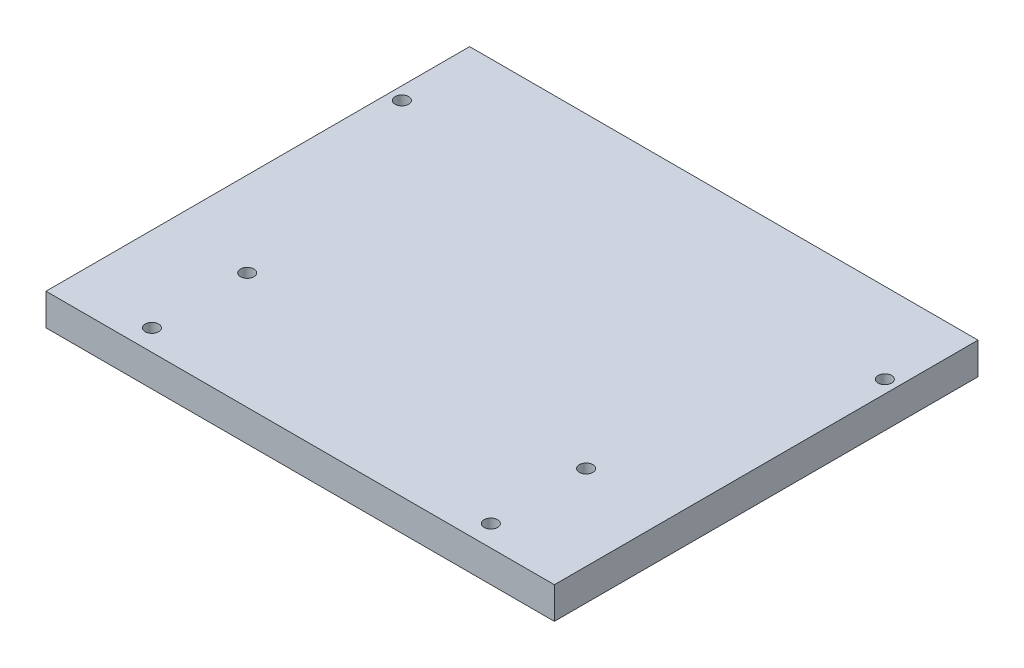
ISO-10303-21;
HEADER;
FILE_DESCRIPTION(('STEP AP214'),'2;1');
FILE_NAME('part.step','',(''),(''),'','','');
FILE_SCHEMA(('AUTOMOTIVE_DESIGN { 1 0 10303 214 1 1 1 1 }'));
ENDSEC;
DATA;
#1=APPLICATION_CONTEXT('core data for automotive mechanical design processes');
#2=APPLICATION_PROTOCOL_DEFINITION('international standard','automotive_design',2000,#1);
#3=PRODUCT_CONTEXT('',#1,'mechanical');
#4=PRODUCT('Part','Part','',(#3));
#5=PRODUCT_RELATED_PRODUCT_CATEGORY('part','',(#4));
#6=PRODUCT_DEFINITION_FORMATION('','',#4);
#7=PRODUCT_DEFINITION_CONTEXT('part definition',#1,'design');
#8=PRODUCT_DEFINITION('design','',#6,#7);
#9=PRODUCT_DEFINITION_SHAPE('','',#8);
#10=(LENGTH_UNIT() NAMED_UNIT(*) SI_UNIT(.MILLI.,.METRE.));
#11=(NAMED_UNIT(*) PLANE_ANGLE_UNIT() SI_UNIT($,.RADIAN.));
#12=(NAMED_UNIT(*) SI_UNIT($,.STERADIAN.) SOLID_ANGLE_UNIT());
#13=UNCERTAINTY_MEASURE_WITH_UNIT(LENGTH_MEASURE(1.E-05),#10,'distance_accuracy_value','');
#14=(GEOMETRIC_REPRESENTATION_CONTEXT(3) GLOBAL_UNCERTAINTY_ASSIGNED_CONTEXT((#13)) GLOBAL_UNIT_ASSIGNED_CONTEXT((#10,
#11,#12)) REPRESENTATION_CONTEXT('',''));
#15=CARTESIAN_POINT('',(0.,0.,0.));
#16=DIRECTION('',(0.,0.,1.));
#17=DIRECTION('',(1.,0.,0.));
#18=AXIS2_PLACEMENT_3D('',#15,#16,#17);
#19=CARTESIAN_POINT('',(0.,9.525,0.));
#20=DIRECTION('',(0.,-1.,0.));
#21=DIRECTION('',(0.,0.,-1.));
#22=AXIS2_PLACEMENT_3D('',#19,#20,#21);
#23=PLANE('',#22);
#24=CARTESIAN_POINT('',(3.81,9.525,-102.87));
#25=DIRECTION('',(0.,1.,0.));
#26=DIRECTION('',(0.,0.,1.));
#27=AXIS2_PLACEMENT_3D('',#24,#25,#26);
#28=CIRCLE('',#27,2.01929999999999);
#29=CARTESIAN_POINT('',(3.81,9.525,-100.8507));
#30=VERTEX_POINT('',#29);
#31=EDGE_CURVE('E149',#30,#30,#28,.T.);
#32=ORIENTED_EDGE('',*,*,#31,.F.);
#33=EDGE_LOOP('',(#32));
#34=FACE_BOUND('',#33,.T.);
#35=CARTESIAN_POINT('',(148.59,9.525,-102.87));
#36=DIRECTION('',(0.,1.,0.));
#37=DIRECTION('',(0.,0.,1.));
#38=AXIS2_PLACEMENT_3D('',#35,#36,#37);
#39=CIRCLE('',#38,2.0193);
#40=CARTESIAN_POINT('',(148.59,9.525,-100.8507));
#41=VERTEX_POINT('',#40);
#42=EDGE_CURVE('E143',#41,#41,#39,.T.);
#43=ORIENTED_EDGE('',*,*,#42,.F.);
#44=EDGE_LOOP('',(#43));
#45=FACE_BOUND('',#44,.T.);
#46=CARTESIAN_POINT('',(25.4,9.525,-34.925));
#47=DIRECTION('',(0.,1.,0.));
#48=DIRECTION('',(0.,0.,1.));
#49=AXIS2_PLACEMENT_3D('',#46,#47,#48);
#50=CIRCLE('',#49,2.0193);
#51=CARTESIAN_POINT('',(25.4,9.525,-32.9057));
#52=VERTEX_POINT('',#51);
#53=EDGE_CURVE('E131',#52,#52,#50,.T.);
#54=ORIENTED_EDGE('',*,*,#53,.F.);
#55=EDGE_LOOP('',(#54));
#56=FACE_BOUND('',#55,.T.);
#57=CARTESIAN_POINT('',(127.,9.525,-34.925));
#58=DIRECTION('',(0.,1.,0.));
#59=DIRECTION('',(0.,0.,1.));
#60=AXIS2_PLACEMENT_3D('',#57,#58,#59);
#61=CIRCLE('',#60,2.0193);
#62=CARTESIAN_POINT('',(127.,9.525,-32.9057));
#63=VERTEX_POINT('',#62);
#64=EDGE_CURVE('E125',#63,#63,#61,.T.);
#65=ORIENTED_EDGE('',*,*,#64,.F.);
#66=EDGE_LOOP('',(#65));
#67=FACE_BOUND('',#66,.T.);
#68=CARTESIAN_POINT('',(127.,9.525,-6.35));
#69=DIRECTION('',(0.,1.,0.));
#70=DIRECTION('',(0.,0.,1.));
#71=AXIS2_PLACEMENT_3D('',#68,#69,#70);
#72=CIRCLE('',#71,2.0193);
#73=CARTESIAN_POINT('',(127.,9.525,-4.3307));
#74=VERTEX_POINT('',#73);
#75=EDGE_CURVE('E119',#74,#74,#72,.T.);
#76=ORIENTED_EDGE('',*,*,#75,.F.);
#77=EDGE_LOOP('',(#76));
#78=FACE_BOUND('',#77,.T.);
#79=DIRECTION('',(0.,0.,1.));
#80=VECTOR('',#79,1.);
#81=CARTESIAN_POINT('',(0.,9.525,0.));
#82=LINE('',#81,#80);
#83=CARTESIAN_POINT('',(0.,9.525,-127.));
#84=VERTEX_POINT('',#83);
#85=CARTESIAN_POINT('',(0.,9.525,0.));
#86=VERTEX_POINT('',#85);
#87=EDGE_CURVE('E91',#84,#86,#82,.T.);
#88=ORIENTED_EDGE('',*,*,#87,.T.);
#89=DIRECTION('',(1.,0.,0.));
#90=VECTOR('',#89,1.);
#91=CARTESIAN_POINT('',(0.,9.525,0.));
#92=LINE('',#91,#90);
#93=CARTESIAN_POINT('',(152.4,9.525,0.));
#94=VERTEX_POINT('',#93);
#95=EDGE_CURVE('E86',#86,#94,#92,.T.);
#96=ORIENTED_EDGE('',*,*,#95,.T.);
#97=DIRECTION('',(0.,0.,-1.));
#98=VECTOR('',#97,1.);
#99=CARTESIAN_POINT('',(152.4,9.525,0.));
#100=LINE('',#99,#98);
#101=CARTESIAN_POINT('',(152.4,9.525,-127.));
#102=VERTEX_POINT('',#101);
#103=EDGE_CURVE('E89',#94,#102,#100,.T.);
#104=ORIENTED_EDGE('',*,*,#103,.T.);
#105=DIRECTION('',(-1.,0.,0.));
#106=VECTOR('',#105,1.);
#107=CARTESIAN_POINT('',(0.,9.525,-127.));
#108=LINE('',#107,#106);
#109=EDGE_CURVE('E56',#102,#84,#108,.T.);
#110=ORIENTED_EDGE('',*,*,#109,.T.);
#111=EDGE_LOOP('',(#88,#96,#104,#110));
#112=FACE_BOUND('',#111,.T.);
#113=CARTESIAN_POINT('',(25.4,9.525,-6.35));
#114=DIRECTION('',(0.,1.,0.));
#115=DIRECTION('',(0.,0.,1.));
#116=AXIS2_PLACEMENT_3D('',#113,#114,#115);
#117=CIRCLE('',#116,2.0193);
#118=CARTESIAN_POINT('',(25.4,9.525,-4.3307));
#119=VERTEX_POINT('',#118);
#120=EDGE_CURVE('E137',#119,#119,#117,.T.);
#121=ORIENTED_EDGE('',*,*,#120,.F.);
#122=EDGE_LOOP('',(#121));
#123=FACE_BOUND('',#122,.T.);
#124=ADVANCED_FACE('F39',(#34,#45,#56,#67,#78,#112,#123),#23,.F.);
#125=CARTESIAN_POINT('',(0.,9.525,0.));
#126=DIRECTION('',(1.,0.,0.));
#127=DIRECTION('',(0.,0.,-1.));
#128=AXIS2_PLACEMENT_3D('',#125,#126,#127);
#129=PLANE('',#128);
#130=DIRECTION('',(0.,0.,1.));
#131=VECTOR('',#130,1.);
#132=CARTESIAN_POINT('',(0.,0.,0.));
#133=LINE('',#132,#131);
#134=CARTESIAN_POINT('',(0.,0.,-127.));
#135=VERTEX_POINT('',#134);
#136=CARTESIAN_POINT('',(0.,0.,0.));
#137=VERTEX_POINT('',#136);
#138=EDGE_CURVE('E103',#135,#137,#133,.T.);
#139=ORIENTED_EDGE('',*,*,#138,.T.);
#140=DIRECTION('',(0.,-1.,0.));
#141=VECTOR('',#140,1.);
#142=CARTESIAN_POINT('',(0.,9.525,0.));
#143=LINE('',#142,#141);
#144=EDGE_CURVE('E11',#86,#137,#143,.T.);
#145=ORIENTED_EDGE('',*,*,#144,.F.);
#146=ORIENTED_EDGE('',*,*,#87,.F.);
#147=DIRECTION('',(0.,-1.,0.));
#148=VECTOR('',#147,1.);
#149=CARTESIAN_POINT('',(0.,9.525,-127.));
#150=LINE('',#149,#148);
#151=EDGE_CURVE('E99',#84,#135,#150,.T.);
#152=ORIENTED_EDGE('',*,*,#151,.T.);
#153=EDGE_LOOP('',(#139,#145,#146,#152));
#154=FACE_BOUND('',#153,.T.);
#155=ADVANCED_FACE('F41',(#154),#129,.F.);
#156=CARTESIAN_POINT('',(0.,9.525,0.));
#157=DIRECTION('',(0.,0.,-1.));
#158=DIRECTION('',(-1.,0.,0.));
#159=AXIS2_PLACEMENT_3D('',#156,#157,#158);
#160=PLANE('',#159);
#161=DIRECTION('',(1.,0.,0.));
#162=VECTOR('',#161,1.);
#163=CARTESIAN_POINT('',(0.,0.,0.));
#164=LINE('',#163,#162);
#165=CARTESIAN_POINT('',(152.4,0.,0.));
#166=VERTEX_POINT('',#165);
#167=EDGE_CURVE('E95',#137,#166,#164,.T.);
#168=ORIENTED_EDGE('',*,*,#167,.T.);
#169=DIRECTION('',(0.,-1.,0.));
#170=VECTOR('',#169,1.);
#171=CARTESIAN_POINT('',(152.4,9.525,0.));
#172=LINE('',#171,#170);
#173=EDGE_CURVE('E48',#94,#166,#172,.T.);
#174=ORIENTED_EDGE('',*,*,#173,.F.);
#175=ORIENTED_EDGE('',*,*,#95,.F.);
#176=ORIENTED_EDGE('',*,*,#144,.T.);
#177=EDGE_LOOP('',(#168,#174,#175,#176));
#178=FACE_BOUND('',#177,.T.);
#179=ADVANCED_FACE('F94',(#178),#160,.F.);
#180=CARTESIAN_POINT('',(152.4,9.525,0.));
#181=DIRECTION('',(-1.,0.,0.));
#182=DIRECTION('',(0.,0.,1.));
#183=AXIS2_PLACEMENT_3D('',#180,#181,#182);
#184=PLANE('',#183);
#185=DIRECTION('',(0.,0.,-1.));
#186=VECTOR('',#185,1.);
#187=CARTESIAN_POINT('',(152.4,0.,0.));
#188=LINE('',#187,#186);
#189=CARTESIAN_POINT('',(152.4,0.,-127.));
#190=VERTEX_POINT('',#189);
#191=EDGE_CURVE('E73',#166,#190,#188,.T.);
#192=ORIENTED_EDGE('',*,*,#191,.T.);
#193=DIRECTION('',(0.,-1.,0.));
#194=VECTOR('',#193,1.);
#195=CARTESIAN_POINT('',(152.4,9.525,-127.));
#196=LINE('',#195,#194);
#197=EDGE_CURVE('E96',#102,#190,#196,.T.);
#198=ORIENTED_EDGE('',*,*,#197,.F.);
#199=ORIENTED_EDGE('',*,*,#103,.F.);
#200=ORIENTED_EDGE('',*,*,#173,.T.);
#201=EDGE_LOOP('',(#192,#198,#199,#200));
#202=FACE_BOUND('',#201,.T.);
#203=ADVANCED_FACE('F97',(#202),#184,.F.);
#204=CARTESIAN_POINT('',(0.,9.525,-127.));
#205=DIRECTION('',(0.,0.,1.));
#206=DIRECTION('',(1.,0.,0.));
#207=AXIS2_PLACEMENT_3D('',#204,#205,#206);
#208=PLANE('',#207);
#209=DIRECTION('',(-1.,0.,0.));
#210=VECTOR('',#209,1.);
#211=CARTESIAN_POINT('',(0.,0.,-127.));
#212=LINE('',#211,#210);
#213=EDGE_CURVE('E79',#190,#135,#212,.T.);
#214=ORIENTED_EDGE('',*,*,#213,.T.);
#215=ORIENTED_EDGE('',*,*,#151,.F.);
#216=ORIENTED_EDGE('',*,*,#109,.F.);
#217=ORIENTED_EDGE('',*,*,#197,.T.);
#218=EDGE_LOOP('',(#214,#215,#216,#217));
#219=FACE_BOUND('',#218,.T.);
#220=ADVANCED_FACE('F111',(#219),#208,.F.);
#221=CARTESIAN_POINT('',(0.,0.,0.));
#222=DIRECTION('',(0.,-1.,0.));
#223=DIRECTION('',(0.,0.,-1.));
#224=AXIS2_PLACEMENT_3D('',#221,#222,#223);
#225=PLANE('',#224);
#226=CARTESIAN_POINT('',(3.81,0.,-102.87));
#227=DIRECTION('',(0.,1.,0.));
#228=DIRECTION('',(0.,0.,1.));
#229=AXIS2_PLACEMENT_3D('',#226,#227,#228);
#230=CIRCLE('',#229,2.0193);
#231=CARTESIAN_POINT('',(3.81,0.,-100.8507));
#232=VERTEX_POINT('',#231);
#233=EDGE_CURVE('E146',#232,#232,#230,.T.);
#234=ORIENTED_EDGE('',*,*,#233,.T.);
#235=EDGE_LOOP('',(#234));
#236=FACE_BOUND('',#235,.T.);
#237=CARTESIAN_POINT('',(148.59,0.,-102.87));
#238=DIRECTION('',(0.,1.,0.));
#239=DIRECTION('',(0.,0.,1.));
#240=AXIS2_PLACEMENT_3D('',#237,#238,#239);
#241=CIRCLE('',#240,2.0193);
#242=CARTESIAN_POINT('',(148.59,0.,-100.8507));
#243=VERTEX_POINT('',#242);
#244=EDGE_CURVE('E140',#243,#243,#241,.T.);
#245=ORIENTED_EDGE('',*,*,#244,.T.);
#246=EDGE_LOOP('',(#245));
#247=FACE_BOUND('',#246,.T.);
#248=CARTESIAN_POINT('',(25.4,0.,-6.35));
#249=DIRECTION('',(0.,-1.,0.));
#250=DIRECTION('',(0.,0.,-1.));
#251=AXIS2_PLACEMENT_3D('',#248,#249,#250);
#252=CIRCLE('',#251,2.0193);
#253=CARTESIAN_POINT('',(25.4,0.,-8.3693));
#254=VERTEX_POINT('',#253);
#255=EDGE_CURVE('E134',#254,#254,#252,.T.);
#256=ORIENTED_EDGE('',*,*,#255,.F.);
#257=EDGE_LOOP('',(#256));
#258=FACE_BOUND('',#257,.T.);
#259=CARTESIAN_POINT('',(25.4,0.,-34.925));
#260=DIRECTION('',(0.,-1.,0.));
#261=DIRECTION('',(0.,0.,-1.));
#262=AXIS2_PLACEMENT_3D('',#259,#260,#261);
#263=CIRCLE('',#262,2.0193);
#264=CARTESIAN_POINT('',(25.4,0.,-36.9443));
#265=VERTEX_POINT('',#264);
#266=EDGE_CURVE('E128',#265,#265,#263,.T.);
#267=ORIENTED_EDGE('',*,*,#266,.F.);
#268=EDGE_LOOP('',(#267));
#269=FACE_BOUND('',#268,.T.);
#270=CARTESIAN_POINT('',(127.,0.,-34.925));
#271=DIRECTION('',(0.,-1.,0.));
#272=DIRECTION('',(0.,0.,-1.));
#273=AXIS2_PLACEMENT_3D('',#270,#271,#272);
#274=CIRCLE('',#273,2.0193);
#275=CARTESIAN_POINT('',(127.,0.,-36.9443));
#276=VERTEX_POINT('',#275);
#277=EDGE_CURVE('E122',#276,#276,#274,.T.);
#278=ORIENTED_EDGE('',*,*,#277,.F.);
#279=EDGE_LOOP('',(#278));
#280=FACE_BOUND('',#279,.T.);
#281=CARTESIAN_POINT('',(127.,0.,-6.35));
#282=DIRECTION('',(0.,-1.,0.));
#283=DIRECTION('',(0.,0.,-1.));
#284=AXIS2_PLACEMENT_3D('',#281,#282,#283);
#285=CIRCLE('',#284,2.0193);
#286=CARTESIAN_POINT('',(127.,0.,-8.3693));
#287=VERTEX_POINT('',#286);
#288=EDGE_CURVE('E106',#287,#287,#285,.T.);
#289=ORIENTED_EDGE('',*,*,#288,.F.);
#290=EDGE_LOOP('',(#289));
#291=FACE_BOUND('',#290,.T.);
#292=ORIENTED_EDGE('',*,*,#138,.F.);
#293=ORIENTED_EDGE('',*,*,#213,.F.);
#294=ORIENTED_EDGE('',*,*,#191,.F.);
#295=ORIENTED_EDGE('',*,*,#167,.F.);
#296=EDGE_LOOP('',(#292,#293,#294,#295));
#297=FACE_BOUND('',#296,.T.);
#298=ADVANCED_FACE('F114',(#236,#247,#258,#269,#280,#291,#297),#225,.T.);
#299=CARTESIAN_POINT('',(127.,9.525,-6.35));
#300=DIRECTION('',(0.,1.,0.));
#301=DIRECTION('',(0.,0.,1.));
#302=AXIS2_PLACEMENT_3D('',#299,#300,#301);
#303=CYLINDRICAL_SURFACE('',#302,2.0193);
#304=ORIENTED_EDGE('',*,*,#75,.T.);
#305=EDGE_LOOP('',(#304));
#306=FACE_BOUND('',#305,.T.);
#307=ORIENTED_EDGE('',*,*,#288,.T.);
#308=EDGE_LOOP('',(#307));
#309=FACE_BOUND('',#308,.T.);
#310=ADVANCED_FACE('F166',(#306,#309),#303,.F.);
#311=CARTESIAN_POINT('',(127.,9.525,-34.925));
#312=DIRECTION('',(0.,1.,0.));
#313=DIRECTION('',(0.,0.,1.));
#314=AXIS2_PLACEMENT_3D('',#311,#312,#313);
#315=CYLINDRICAL_SURFACE('',#314,2.0193);
#316=ORIENTED_EDGE('',*,*,#64,.T.);
#317=EDGE_LOOP('',(#316));
#318=FACE_BOUND('',#317,.T.);
#319=ORIENTED_EDGE('',*,*,#277,.T.);
#320=EDGE_LOOP('',(#319));
#321=FACE_BOUND('',#320,.T.);
#322=ADVANCED_FACE('F169',(#318,#321),#315,.F.);
#323=CARTESIAN_POINT('',(25.4,9.525,-34.925));
#324=DIRECTION('',(0.,1.,0.));
#325=DIRECTION('',(0.,0.,1.));
#326=AXIS2_PLACEMENT_3D('',#323,#324,#325);
#327=CYLINDRICAL_SURFACE('',#326,2.0193);
#328=ORIENTED_EDGE('',*,*,#53,.T.);
#329=EDGE_LOOP('',(#328));
#330=FACE_BOUND('',#329,.T.);
#331=ORIENTED_EDGE('',*,*,#266,.T.);
#332=EDGE_LOOP('',(#331));
#333=FACE_BOUND('',#332,.T.);
#334=ADVANCED_FACE('F242',(#330,#333),#327,.F.);
#335=CARTESIAN_POINT('',(25.4,9.525,-6.35));
#336=DIRECTION('',(0.,1.,0.));
#337=DIRECTION('',(0.,0.,1.));
#338=AXIS2_PLACEMENT_3D('',#335,#336,#337);
#339=CYLINDRICAL_SURFACE('',#338,2.0193);
#340=ORIENTED_EDGE('',*,*,#120,.T.);
#341=EDGE_LOOP('',(#340));
#342=FACE_BOUND('',#341,.T.);
#343=ORIENTED_EDGE('',*,*,#255,.T.);
#344=EDGE_LOOP('',(#343));
#345=FACE_BOUND('',#344,.T.);
#346=ADVANCED_FACE('F200',(#342,#345),#339,.F.);
#347=CARTESIAN_POINT('',(148.59,9.525,-102.87));
#348=DIRECTION('',(0.,1.,0.));
#349=DIRECTION('',(0.,0.,1.));
#350=AXIS2_PLACEMENT_3D('',#347,#348,#349);
#351=CYLINDRICAL_SURFACE('',#350,2.0193);
#352=ORIENTED_EDGE('',*,*,#244,.F.);
#353=EDGE_LOOP('',(#352));
#354=FACE_BOUND('',#353,.T.);
#355=ORIENTED_EDGE('',*,*,#42,.T.);
#356=EDGE_LOOP('',(#355));
#357=FACE_BOUND('',#356,.T.);
#358=ADVANCED_FACE('F210',(#354,#357),#351,.F.);
#359=CARTESIAN_POINT('',(3.81,9.525,-102.87));
#360=DIRECTION('',(0.,1.,0.));
#361=DIRECTION('',(0.,0.,1.));
#362=AXIS2_PLACEMENT_3D('',#359,#360,#361);
#363=CYLINDRICAL_SURFACE('',#362,2.01929999999999);
#364=ORIENTED_EDGE('',*,*,#233,.F.);
#365=EDGE_LOOP('',(#364));
#366=FACE_BOUND('',#365,.T.);
#367=ORIENTED_EDGE('',*,*,#31,.T.);
#368=EDGE_LOOP('',(#367));
#369=FACE_BOUND('',#368,.T.);
#370=ADVANCED_FACE('F153',(#366,#369),#363,.F.);
#371=CLOSED_SHELL('',(#124,#155,#179,#203,#220,#298,#310,#322,#334,#346,#358,#370));
#372=MANIFOLD_SOLID_BREP('B2',#371);
#373=ADVANCED_BREP_SHAPE_REPRESENTATION('',(#18,#372),#14);
#374=SHAPE_DEFINITION_REPRESENTATION(#9,#373);
ENDSEC;
END-ISO-10303-21;
